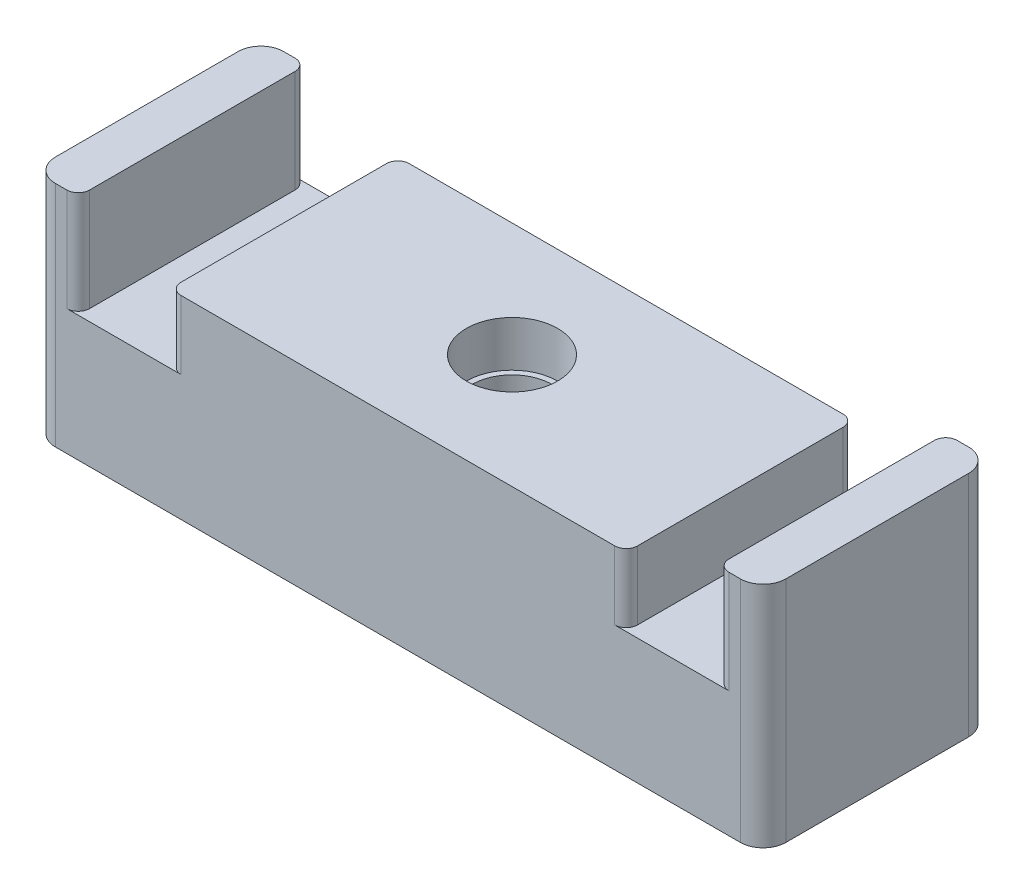
ISO-10303-21;
HEADER;
FILE_DESCRIPTION(('STEP AP214'),'2;1');
FILE_NAME('part.step','',(''),(''),'','','');
FILE_SCHEMA(('AUTOMOTIVE_DESIGN { 1 0 10303 214 1 1 1 1 }'));
ENDSEC;
DATA;
#1=APPLICATION_CONTEXT('core data for automotive mechanical design processes');
#2=APPLICATION_PROTOCOL_DEFINITION('international standard','automotive_design',2000,#1);
#3=PRODUCT_CONTEXT('',#1,'mechanical');
#4=PRODUCT('Part','Part','',(#3));
#5=PRODUCT_RELATED_PRODUCT_CATEGORY('part','',(#4));
#6=PRODUCT_DEFINITION_FORMATION('','',#4);
#7=PRODUCT_DEFINITION_CONTEXT('part definition',#1,'design');
#8=PRODUCT_DEFINITION('design','',#6,#7);
#9=PRODUCT_DEFINITION_SHAPE('','',#8);
#10=(LENGTH_UNIT() NAMED_UNIT(*) SI_UNIT(.MILLI.,.METRE.));
#11=(NAMED_UNIT(*) PLANE_ANGLE_UNIT() SI_UNIT($,.RADIAN.));
#12=(NAMED_UNIT(*) SI_UNIT($,.STERADIAN.) SOLID_ANGLE_UNIT());
#13=UNCERTAINTY_MEASURE_WITH_UNIT(LENGTH_MEASURE(1.E-05),#10,'distance_accuracy_value','');
#14=(GEOMETRIC_REPRESENTATION_CONTEXT(3) GLOBAL_UNCERTAINTY_ASSIGNED_CONTEXT((#13)) GLOBAL_UNIT_ASSIGNED_CONTEXT((#10,
#11,#12)) REPRESENTATION_CONTEXT('',''));
#15=CARTESIAN_POINT('',(0.,0.,0.));
#16=DIRECTION('',(0.,0.,1.));
#17=DIRECTION('',(1.,0.,0.));
#18=AXIS2_PLACEMENT_3D('',#15,#16,#17);
#19=CARTESIAN_POINT('',(0.,-7.5,5.));
#20=DIRECTION('',(0.,1.,0.));
#21=DIRECTION('',(0.,0.,1.));
#22=AXIS2_PLACEMENT_3D('',#19,#20,#21);
#23=CYLINDRICAL_SURFACE('',#22,1.75);
#24=CARTESIAN_POINT('',(0.,-7.5,5.));
#25=DIRECTION('',(0.,1.,0.));
#26=DIRECTION('',(0.,0.,1.));
#27=AXIS2_PLACEMENT_3D('',#24,#25,#26);
#28=CIRCLE('',#27,1.75);
#29=CARTESIAN_POINT('',(0.,-7.5,6.75));
#30=VERTEX_POINT('',#29);
#31=EDGE_CURVE('E275',#30,#30,#28,.T.);
#32=ORIENTED_EDGE('',*,*,#31,.F.);
#33=EDGE_LOOP('',(#32));
#34=FACE_BOUND('',#33,.T.);
#35=CARTESIAN_POINT('',(0.,-1.,5.));
#36=DIRECTION('',(0.,1.,0.));
#37=DIRECTION('',(0.,0.,1.));
#38=AXIS2_PLACEMENT_3D('',#35,#36,#37);
#39=CIRCLE('',#38,1.75);
#40=CARTESIAN_POINT('',(0.,-1.,6.75));
#41=VERTEX_POINT('',#40);
#42=EDGE_CURVE('E36',#41,#41,#39,.F.);
#43=ORIENTED_EDGE('',*,*,#42,.F.);
#44=EDGE_LOOP('',(#43));
#45=FACE_BOUND('',#44,.T.);
#46=ADVANCED_FACE('F32',(#34,#45),#23,.F.);
#47=CARTESIAN_POINT('',(10.,0.,10.));
#48=DIRECTION('',(-1.,0.,0.));
#49=DIRECTION('',(0.,-1.,0.));
#50=AXIS2_PLACEMENT_3D('',#47,#48,#49);
#51=PLANE('',#50);
#52=DIRECTION('',(0.,0.,-1.));
#53=VECTOR('',#52,1.);
#54=CARTESIAN_POINT('',(10.,0.999999999999997,0.));
#55=LINE('',#54,#53);
#56=CARTESIAN_POINT('',(10.,0.999999999999997,9.5));
#57=VERTEX_POINT('',#56);
#58=CARTESIAN_POINT('',(10.,0.999999999999997,0.500000000000001));
#59=VERTEX_POINT('',#58);
#60=EDGE_CURVE('E399',#57,#59,#55,.T.);
#61=ORIENTED_EDGE('',*,*,#60,.F.);
#62=DIRECTION('',(0.,1.,0.));
#63=VECTOR('',#62,1.);
#64=CARTESIAN_POINT('',(10.,0.,9.5));
#65=LINE('',#64,#63);
#66=CARTESIAN_POINT('',(10.,-2.,9.5));
#67=VERTEX_POINT('',#66);
#68=EDGE_CURVE('E230',#57,#67,#65,.F.);
#69=ORIENTED_EDGE('',*,*,#68,.T.);
#70=DIRECTION('',(0.,0.,-1.));
#71=VECTOR('',#70,1.);
#72=CARTESIAN_POINT('',(10.,-2.,10.));
#73=LINE('',#72,#71);
#74=CARTESIAN_POINT('',(10.,-2.,0.5));
#75=VERTEX_POINT('',#74);
#76=EDGE_CURVE('E295',#67,#75,#73,.T.);
#77=ORIENTED_EDGE('',*,*,#76,.T.);
#78=DIRECTION('',(0.,1.,0.));
#79=VECTOR('',#78,1.);
#80=CARTESIAN_POINT('',(10.,2.5,0.5));
#81=LINE('',#80,#79);
#82=EDGE_CURVE('E227',#75,#59,#81,.T.);
#83=ORIENTED_EDGE('',*,*,#82,.T.);
#84=EDGE_LOOP('',(#61,#69,#77,#83));
#85=FACE_BOUND('',#84,.T.);
#86=ADVANCED_FACE('F398',(#85),#51,.F.);
#87=CARTESIAN_POINT('',(-10.,0.,10.));
#88=DIRECTION('',(1.,0.,0.));
#89=DIRECTION('',(0.,1.,0.));
#90=AXIS2_PLACEMENT_3D('',#87,#88,#89);
#91=PLANE('',#90);
#92=DIRECTION('',(0.,0.,1.));
#93=VECTOR('',#92,1.);
#94=CARTESIAN_POINT('',(-10.,0.999999999999997,0.));
#95=LINE('',#94,#93);
#96=CARTESIAN_POINT('',(-10.,0.999999999999997,0.500000000000001));
#97=VERTEX_POINT('',#96);
#98=CARTESIAN_POINT('',(-10.,0.999999999999997,9.5));
#99=VERTEX_POINT('',#98);
#100=EDGE_CURVE('E193',#97,#99,#95,.T.);
#101=ORIENTED_EDGE('',*,*,#100,.F.);
#102=DIRECTION('',(0.,-1.,0.));
#103=VECTOR('',#102,1.);
#104=CARTESIAN_POINT('',(-10.,-2.,0.5));
#105=LINE('',#104,#103);
#106=CARTESIAN_POINT('',(-10.,-2.,0.5));
#107=VERTEX_POINT('',#106);
#108=EDGE_CURVE('E203',#97,#107,#105,.T.);
#109=ORIENTED_EDGE('',*,*,#108,.T.);
#110=DIRECTION('',(0.,0.,-1.));
#111=VECTOR('',#110,1.);
#112=CARTESIAN_POINT('',(-10.,-2.,10.));
#113=LINE('',#112,#111);
#114=CARTESIAN_POINT('',(-10.,-2.,9.5));
#115=VERTEX_POINT('',#114);
#116=EDGE_CURVE('E268',#115,#107,#113,.T.);
#117=ORIENTED_EDGE('',*,*,#116,.F.);
#118=DIRECTION('',(0.,-1.,0.));
#119=VECTOR('',#118,1.);
#120=CARTESIAN_POINT('',(-10.,0.,9.5));
#121=LINE('',#120,#119);
#122=EDGE_CURVE('E206',#115,#99,#121,.F.);
#123=ORIENTED_EDGE('',*,*,#122,.T.);
#124=EDGE_LOOP('',(#101,#109,#117,#123));
#125=FACE_BOUND('',#124,.T.);
#126=ADVANCED_FACE('F201',(#125),#91,.F.);
#127=CARTESIAN_POINT('',(10.,-2.,10.));
#128=DIRECTION('',(0.,0.,-1.));
#129=DIRECTION('',(-1.,0.,0.));
#130=AXIS2_PLACEMENT_3D('',#127,#128,#129);
#131=PLANE('',#130);
#132=DIRECTION('',(1.,0.,0.));
#133=VECTOR('',#132,1.);
#134=CARTESIAN_POINT('',(-10.,0.999999999999997,10.));
#135=LINE('',#134,#133);
#136=CARTESIAN_POINT('',(-9.5,0.999999999999997,10.));
#137=VERTEX_POINT('',#136);
#138=CARTESIAN_POINT('',(9.5,0.999999999999997,10.));
#139=VERTEX_POINT('',#138);
#140=EDGE_CURVE('E207',#137,#139,#135,.T.);
#141=ORIENTED_EDGE('',*,*,#140,.F.);
#142=DIRECTION('',(0.,-1.,0.));
#143=VECTOR('',#142,1.);
#144=CARTESIAN_POINT('',(-9.5,-2.00000000000002,10.));
#145=LINE('',#144,#143);
#146=CARTESIAN_POINT('',(-9.5,-2.,10.));
#147=VERTEX_POINT('',#146);
#148=EDGE_CURVE('E211',#137,#147,#145,.T.);
#149=ORIENTED_EDGE('',*,*,#148,.T.);
#150=DIRECTION('',(-1.,0.,0.));
#151=VECTOR('',#150,1.);
#152=CARTESIAN_POINT('',(-10.,-2.,10.));
#153=LINE('',#152,#151);
#154=CARTESIAN_POINT('',(-14.5,-2.00000000000001,10.));
#155=VERTEX_POINT('',#154);
#156=EDGE_CURVE('E294',#147,#155,#153,.T.);
#157=ORIENTED_EDGE('',*,*,#156,.T.);
#158=DIRECTION('',(0.,1.,0.));
#159=VECTOR('',#158,1.);
#160=CARTESIAN_POINT('',(-14.5,-2.00000000000002,10.));
#161=LINE('',#160,#159);
#162=CARTESIAN_POINT('',(-14.5,2.5,10.));
#163=VERTEX_POINT('',#162);
#164=EDGE_CURVE('E360',#155,#163,#161,.T.);
#165=ORIENTED_EDGE('',*,*,#164,.T.);
#166=DIRECTION('',(-1.,0.,0.));
#167=VECTOR('',#166,1.);
#168=CARTESIAN_POINT('',(-16.,2.5,10.));
#169=LINE('',#168,#167);
#170=CARTESIAN_POINT('',(-15.,2.5,10.));
#171=VERTEX_POINT('',#170);
#172=EDGE_CURVE('E415',#163,#171,#169,.T.);
#173=ORIENTED_EDGE('',*,*,#172,.T.);
#174=DIRECTION('',(0.,-1.,0.));
#175=VECTOR('',#174,1.);
#176=CARTESIAN_POINT('',(-15.,-2.,10.));
#177=LINE('',#176,#175);
#178=CARTESIAN_POINT('',(-15.,-7.5,10.));
#179=VERTEX_POINT('',#178);
#180=EDGE_CURVE('E348',#171,#179,#177,.T.);
#181=ORIENTED_EDGE('',*,*,#180,.T.);
#182=DIRECTION('',(1.,0.,0.));
#183=VECTOR('',#182,1.);
#184=CARTESIAN_POINT('',(-16.,-7.5,10.));
#185=LINE('',#184,#183);
#186=CARTESIAN_POINT('',(15.,-7.5,10.));
#187=VERTEX_POINT('',#186);
#188=EDGE_CURVE('E417',#179,#187,#185,.T.);
#189=ORIENTED_EDGE('',*,*,#188,.T.);
#190=DIRECTION('',(0.,1.,0.));
#191=VECTOR('',#190,1.);
#192=CARTESIAN_POINT('',(15.,-2.,10.));
#193=LINE('',#192,#191);
#194=CARTESIAN_POINT('',(15.,2.5,10.));
#195=VERTEX_POINT('',#194);
#196=EDGE_CURVE('E345',#187,#195,#193,.T.);
#197=ORIENTED_EDGE('',*,*,#196,.T.);
#198=DIRECTION('',(-1.,0.,0.));
#199=VECTOR('',#198,1.);
#200=CARTESIAN_POINT('',(14.,2.5,10.));
#201=LINE('',#200,#199);
#202=CARTESIAN_POINT('',(14.5,2.5,10.));
#203=VERTEX_POINT('',#202);
#204=EDGE_CURVE('E372',#195,#203,#201,.T.);
#205=ORIENTED_EDGE('',*,*,#204,.T.);
#206=DIRECTION('',(0.,-1.,0.));
#207=VECTOR('',#206,1.);
#208=CARTESIAN_POINT('',(14.5,-2.00000000000001,10.));
#209=LINE('',#208,#207);
#210=CARTESIAN_POINT('',(14.5,-2.00000000000001,10.));
#211=VERTEX_POINT('',#210);
#212=EDGE_CURVE('E215',#203,#211,#209,.T.);
#213=ORIENTED_EDGE('',*,*,#212,.T.);
#214=DIRECTION('',(-1.,0.,0.));
#215=VECTOR('',#214,1.);
#216=CARTESIAN_POINT('',(14.,-2.00000000000001,10.));
#217=LINE('',#216,#215);
#218=CARTESIAN_POINT('',(9.5,-2.,10.));
#219=VERTEX_POINT('',#218);
#220=EDGE_CURVE('E283',#211,#219,#217,.T.);
#221=ORIENTED_EDGE('',*,*,#220,.T.);
#222=DIRECTION('',(0.,1.,0.));
#223=VECTOR('',#222,1.);
#224=CARTESIAN_POINT('',(9.5,-2.,10.));
#225=LINE('',#224,#223);
#226=EDGE_CURVE('E363',#219,#139,#225,.T.);
#227=ORIENTED_EDGE('',*,*,#226,.T.);
#228=EDGE_LOOP('',(#141,#149,#157,#165,#173,#181,#189,#197,#205,#213,#221,#227));
#229=FACE_BOUND('',#228,.T.);
#230=ADVANCED_FACE('F370',(#229),#131,.F.);
#231=CARTESIAN_POINT('',(10.,-2.,0.));
#232=DIRECTION('',(0.,0.,-1.));
#233=DIRECTION('',(-1.,0.,0.));
#234=AXIS2_PLACEMENT_3D('',#231,#232,#233);
#235=PLANE('',#234);
#236=DIRECTION('',(0.,-1.,0.));
#237=VECTOR('',#236,1.);
#238=CARTESIAN_POINT('',(-9.5,2.5,0.));
#239=LINE('',#238,#237);
#240=CARTESIAN_POINT('',(-9.5,-2.,0.));
#241=VERTEX_POINT('',#240);
#242=CARTESIAN_POINT('',(-9.5,0.999999999999997,0.));
#243=VERTEX_POINT('',#242);
#244=EDGE_CURVE('E232',#241,#243,#239,.F.);
#245=ORIENTED_EDGE('',*,*,#244,.T.);
#246=DIRECTION('',(-1.,0.,0.));
#247=VECTOR('',#246,1.);
#248=CARTESIAN_POINT('',(-10.,0.999999999999997,0.));
#249=LINE('',#248,#247);
#250=CARTESIAN_POINT('',(9.5,0.999999999999997,0.));
#251=VERTEX_POINT('',#250);
#252=EDGE_CURVE('E48',#251,#243,#249,.T.);
#253=ORIENTED_EDGE('',*,*,#252,.F.);
#254=DIRECTION('',(0.,1.,0.));
#255=VECTOR('',#254,1.);
#256=CARTESIAN_POINT('',(9.5,-2.,0.));
#257=LINE('',#256,#255);
#258=CARTESIAN_POINT('',(9.5,-2.,0.));
#259=VERTEX_POINT('',#258);
#260=EDGE_CURVE('E237',#251,#259,#257,.F.);
#261=ORIENTED_EDGE('',*,*,#260,.T.);
#262=DIRECTION('',(-1.,0.,0.));
#263=VECTOR('',#262,1.);
#264=CARTESIAN_POINT('',(14.,-2.00000000000001,0.));
#265=LINE('',#264,#263);
#266=CARTESIAN_POINT('',(14.5,-2.00000000000001,0.));
#267=VERTEX_POINT('',#266);
#268=EDGE_CURVE('E291',#267,#259,#265,.T.);
#269=ORIENTED_EDGE('',*,*,#268,.F.);
#270=DIRECTION('',(0.,-1.,0.));
#271=VECTOR('',#270,1.);
#272=CARTESIAN_POINT('',(14.5,2.5,0.));
#273=LINE('',#272,#271);
#274=CARTESIAN_POINT('',(14.5,2.5,0.));
#275=VERTEX_POINT('',#274);
#276=EDGE_CURVE('E239',#267,#275,#273,.F.);
#277=ORIENTED_EDGE('',*,*,#276,.T.);
#278=DIRECTION('',(-1.,0.,0.));
#279=VECTOR('',#278,1.);
#280=CARTESIAN_POINT('',(14.,2.5,0.));
#281=LINE('',#280,#279);
#282=CARTESIAN_POINT('',(15.,2.5,0.));
#283=VERTEX_POINT('',#282);
#284=EDGE_CURVE('E288',#283,#275,#281,.T.);
#285=ORIENTED_EDGE('',*,*,#284,.F.);
#286=DIRECTION('',(0.,1.,0.));
#287=VECTOR('',#286,1.);
#288=CARTESIAN_POINT('',(15.,-7.5,0.));
#289=LINE('',#288,#287);
#290=CARTESIAN_POINT('',(15.,-7.5,0.));
#291=VERTEX_POINT('',#290);
#292=EDGE_CURVE('E335',#283,#291,#289,.F.);
#293=ORIENTED_EDGE('',*,*,#292,.T.);
#294=DIRECTION('',(1.,0.,0.));
#295=VECTOR('',#294,1.);
#296=CARTESIAN_POINT('',(-16.,-7.5,0.));
#297=LINE('',#296,#295);
#298=CARTESIAN_POINT('',(-15.,-7.5,0.));
#299=VERTEX_POINT('',#298);
#300=EDGE_CURVE('E277',#299,#291,#297,.T.);
#301=ORIENTED_EDGE('',*,*,#300,.F.);
#302=DIRECTION('',(0.,-1.,0.));
#303=VECTOR('',#302,1.);
#304=CARTESIAN_POINT('',(-15.,2.5,0.));
#305=LINE('',#304,#303);
#306=CARTESIAN_POINT('',(-15.,2.5,0.));
#307=VERTEX_POINT('',#306);
#308=EDGE_CURVE('E337',#299,#307,#305,.F.);
#309=ORIENTED_EDGE('',*,*,#308,.T.);
#310=DIRECTION('',(-1.,0.,0.));
#311=VECTOR('',#310,1.);
#312=CARTESIAN_POINT('',(-16.,2.5,0.));
#313=LINE('',#312,#311);
#314=CARTESIAN_POINT('',(-14.5,2.5,0.));
#315=VERTEX_POINT('',#314);
#316=EDGE_CURVE('E274',#315,#307,#313,.T.);
#317=ORIENTED_EDGE('',*,*,#316,.F.);
#318=DIRECTION('',(0.,1.,0.));
#319=VECTOR('',#318,1.);
#320=CARTESIAN_POINT('',(-14.5,-2.00000000000001,0.));
#321=LINE('',#320,#319);
#322=CARTESIAN_POINT('',(-14.5,-2.00000000000001,0.));
#323=VERTEX_POINT('',#322);
#324=EDGE_CURVE('E234',#315,#323,#321,.F.);
#325=ORIENTED_EDGE('',*,*,#324,.T.);
#326=DIRECTION('',(-1.,0.,0.));
#327=VECTOR('',#326,1.);
#328=CARTESIAN_POINT('',(-10.,-2.,0.));
#329=LINE('',#328,#327);
#330=EDGE_CURVE('E267',#241,#323,#329,.T.);
#331=ORIENTED_EDGE('',*,*,#330,.F.);
#332=EDGE_LOOP('',(#245,#253,#261,#269,#277,#285,#293,#301,#309,#317,#325,#331));
#333=FACE_BOUND('',#332,.T.);
#334=ADVANCED_FACE('F270',(#333),#235,.T.);
#335=CARTESIAN_POINT('',(-9.5,-2.00000000000002,9.5));
#336=DIRECTION('',(0.,-1.,0.));
#337=DIRECTION('',(1.,0.,0.));
#338=AXIS2_PLACEMENT_3D('',#335,#336,#337);
#339=CYLINDRICAL_SURFACE('',#338,0.5);
#340=ORIENTED_EDGE('',*,*,#148,.F.);
#341=CARTESIAN_POINT('',(-9.5,0.999999999999997,9.5));
#342=DIRECTION('',(0.,1.,0.));
#343=DIRECTION('',(0.,0.,1.));
#344=AXIS2_PLACEMENT_3D('',#341,#342,#343);
#345=CIRCLE('',#344,0.5);
#346=EDGE_CURVE('E280',#137,#99,#345,.F.);
#347=ORIENTED_EDGE('',*,*,#346,.T.);
#348=ORIENTED_EDGE('',*,*,#122,.F.);
#349=CARTESIAN_POINT('',(-9.5,-2.,9.5));
#350=DIRECTION('',(0.,-1.,0.));
#351=DIRECTION('',(1.,0.,0.));
#352=AXIS2_PLACEMENT_3D('',#349,#350,#351);
#353=CIRCLE('',#352,0.5);
#354=EDGE_CURVE('E250',#147,#115,#353,.T.);
#355=ORIENTED_EDGE('',*,*,#354,.F.);
#356=EDGE_LOOP('',(#340,#347,#348,#355));
#357=FACE_BOUND('',#356,.T.);
#358=ADVANCED_FACE('F412',(#357),#339,.T.);
#359=CARTESIAN_POINT('',(9.5,-2.,9.5));
#360=DIRECTION('',(0.,1.,0.));
#361=DIRECTION('',(-1.,0.,0.));
#362=AXIS2_PLACEMENT_3D('',#359,#360,#361);
#363=CYLINDRICAL_SURFACE('',#362,0.5);
#364=ORIENTED_EDGE('',*,*,#68,.F.);
#365=CARTESIAN_POINT('',(9.5,0.999999999999997,9.5));
#366=DIRECTION('',(0.,1.,0.));
#367=DIRECTION('',(0.,0.,1.));
#368=AXIS2_PLACEMENT_3D('',#365,#366,#367);
#369=CIRCLE('',#368,0.5);
#370=EDGE_CURVE('E406',#57,#139,#369,.F.);
#371=ORIENTED_EDGE('',*,*,#370,.T.);
#372=ORIENTED_EDGE('',*,*,#226,.F.);
#373=CARTESIAN_POINT('',(9.5,-2.,9.5));
#374=DIRECTION('',(0.,-1.,0.));
#375=DIRECTION('',(1.,0.,0.));
#376=AXIS2_PLACEMENT_3D('',#373,#374,#375);
#377=CIRCLE('',#376,0.5);
#378=EDGE_CURVE('E254',#67,#219,#377,.T.);
#379=ORIENTED_EDGE('',*,*,#378,.F.);
#380=EDGE_LOOP('',(#364,#371,#372,#379));
#381=FACE_BOUND('',#380,.T.);
#382=ADVANCED_FACE('F404',(#381),#363,.T.);
#383=CARTESIAN_POINT('',(9.5,0.,0.5));
#384=DIRECTION('',(0.,-1.,0.));
#385=DIRECTION('',(1.,0.,0.));
#386=AXIS2_PLACEMENT_3D('',#383,#384,#385);
#387=CYLINDRICAL_SURFACE('',#386,0.5);
#388=ORIENTED_EDGE('',*,*,#260,.F.);
#389=CARTESIAN_POINT('',(9.5,0.999999999999997,0.5));
#390=DIRECTION('',(0.,1.,0.));
#391=DIRECTION('',(0.,0.,1.));
#392=AXIS2_PLACEMENT_3D('',#389,#390,#391);
#393=CIRCLE('',#392,0.5);
#394=EDGE_CURVE('E395',#251,#59,#393,.F.);
#395=ORIENTED_EDGE('',*,*,#394,.T.);
#396=ORIENTED_EDGE('',*,*,#82,.F.);
#397=CARTESIAN_POINT('',(9.5,-2.,0.5));
#398=DIRECTION('',(0.,-1.,0.));
#399=DIRECTION('',(1.,0.,0.));
#400=AXIS2_PLACEMENT_3D('',#397,#398,#399);
#401=CIRCLE('',#400,0.5);
#402=EDGE_CURVE('E260',#259,#75,#401,.T.);
#403=ORIENTED_EDGE('',*,*,#402,.F.);
#404=EDGE_LOOP('',(#388,#395,#396,#403));
#405=FACE_BOUND('',#404,.T.);
#406=ADVANCED_FACE('F393',(#405),#387,.T.);
#407=CARTESIAN_POINT('',(-9.5,0.,0.5));
#408=DIRECTION('',(0.,1.,0.));
#409=DIRECTION('',(-1.,0.,0.));
#410=AXIS2_PLACEMENT_3D('',#407,#408,#409);
#411=CYLINDRICAL_SURFACE('',#410,0.5);
#412=ORIENTED_EDGE('',*,*,#108,.F.);
#413=CARTESIAN_POINT('',(-9.5,0.999999999999997,0.5));
#414=DIRECTION('',(0.,1.,0.));
#415=DIRECTION('',(0.,0.,1.));
#416=AXIS2_PLACEMENT_3D('',#413,#414,#415);
#417=CIRCLE('',#416,0.5);
#418=EDGE_CURVE('E11',#97,#243,#417,.F.);
#419=ORIENTED_EDGE('',*,*,#418,.T.);
#420=ORIENTED_EDGE('',*,*,#244,.F.);
#421=CARTESIAN_POINT('',(-9.5,-2.,0.5));
#422=DIRECTION('',(0.,-1.,0.));
#423=DIRECTION('',(1.,0.,0.));
#424=AXIS2_PLACEMENT_3D('',#421,#422,#423);
#425=CIRCLE('',#424,0.5);
#426=EDGE_CURVE('E41',#107,#241,#425,.T.);
#427=ORIENTED_EDGE('',*,*,#426,.F.);
#428=EDGE_LOOP('',(#412,#419,#420,#427));
#429=FACE_BOUND('',#428,.T.);
#430=ADVANCED_FACE('F34',(#429),#411,.T.);
#431=CARTESIAN_POINT('',(-10.,-2.,10.));
#432=DIRECTION('',(0.,-1.,0.));
#433=DIRECTION('',(1.,0.,0.));
#434=AXIS2_PLACEMENT_3D('',#431,#432,#433);
#435=PLANE('',#434);
#436=ORIENTED_EDGE('',*,*,#330,.T.);
#437=CARTESIAN_POINT('',(-14.5,-2.00000000000001,0.5));
#438=DIRECTION('',(0.,-1.,0.));
#439=DIRECTION('',(1.,0.,0.));
#440=AXIS2_PLACEMENT_3D('',#437,#438,#439);
#441=CIRCLE('',#440,0.5);
#442=CARTESIAN_POINT('',(-14.,-2.00000000000001,0.5));
#443=VERTEX_POINT('',#442);
#444=EDGE_CURVE('E55',#323,#443,#441,.T.);
#445=ORIENTED_EDGE('',*,*,#444,.T.);
#446=DIRECTION('',(0.,0.,-1.));
#447=VECTOR('',#446,1.);
#448=CARTESIAN_POINT('',(-14.,-2.00000000000001,10.));
#449=LINE('',#448,#447);
#450=CARTESIAN_POINT('',(-14.,-2.00000000000001,9.5));
#451=VERTEX_POINT('',#450);
#452=EDGE_CURVE('E319',#451,#443,#449,.T.);
#453=ORIENTED_EDGE('',*,*,#452,.F.);
#454=CARTESIAN_POINT('',(-14.5,-2.00000000000001,9.5));
#455=DIRECTION('',(0.,-1.,0.));
#456=DIRECTION('',(1.,0.,0.));
#457=AXIS2_PLACEMENT_3D('',#454,#455,#456);
#458=CIRCLE('',#457,0.5);
#459=EDGE_CURVE('E262',#451,#155,#458,.T.);
#460=ORIENTED_EDGE('',*,*,#459,.T.);
#461=ORIENTED_EDGE('',*,*,#156,.F.);
#462=ORIENTED_EDGE('',*,*,#354,.T.);
#463=ORIENTED_EDGE('',*,*,#116,.T.);
#464=ORIENTED_EDGE('',*,*,#426,.T.);
#465=EDGE_LOOP('',(#436,#445,#453,#460,#461,#462,#463,#464));
#466=FACE_BOUND('',#465,.T.);
#467=ADVANCED_FACE('F266',(#466),#435,.F.);
#468=CARTESIAN_POINT('',(-14.,2.5,10.));
#469=DIRECTION('',(-1.,0.,0.));
#470=DIRECTION('',(0.,-1.,0.));
#471=AXIS2_PLACEMENT_3D('',#468,#469,#470);
#472=PLANE('',#471);
#473=DIRECTION('',(0.,0.,-1.));
#474=VECTOR('',#473,1.);
#475=CARTESIAN_POINT('',(-14.,2.5,10.));
#476=LINE('',#475,#474);
#477=CARTESIAN_POINT('',(-14.,2.5,9.5));
#478=VERTEX_POINT('',#477);
#479=CARTESIAN_POINT('',(-14.,2.5,0.5));
#480=VERTEX_POINT('',#479);
#481=EDGE_CURVE('E316',#478,#480,#476,.T.);
#482=ORIENTED_EDGE('',*,*,#481,.F.);
#483=DIRECTION('',(0.,1.,0.));
#484=VECTOR('',#483,1.);
#485=CARTESIAN_POINT('',(-14.,2.5,9.5));
#486=LINE('',#485,#484);
#487=EDGE_CURVE('E248',#478,#451,#486,.F.);
#488=ORIENTED_EDGE('',*,*,#487,.T.);
#489=ORIENTED_EDGE('',*,*,#452,.T.);
#490=DIRECTION('',(0.,1.,0.));
#491=VECTOR('',#490,1.);
#492=CARTESIAN_POINT('',(-14.,2.5,0.5));
#493=LINE('',#492,#491);
#494=EDGE_CURVE('E245',#443,#480,#493,.T.);
#495=ORIENTED_EDGE('',*,*,#494,.T.);
#496=EDGE_LOOP('',(#482,#488,#489,#495));
#497=FACE_BOUND('',#496,.T.);
#498=ADVANCED_FACE('F499',(#497),#472,.F.);
#499=CARTESIAN_POINT('',(-16.,2.5,10.));
#500=DIRECTION('',(0.,-1.,0.));
#501=DIRECTION('',(1.,0.,0.));
#502=AXIS2_PLACEMENT_3D('',#499,#500,#501);
#503=PLANE('',#502);
#504=ORIENTED_EDGE('',*,*,#172,.F.);
#505=CARTESIAN_POINT('',(-14.5,2.5,9.5));
#506=DIRECTION('',(0.,-1.,0.));
#507=DIRECTION('',(1.,0.,0.));
#508=AXIS2_PLACEMENT_3D('',#505,#506,#507);
#509=CIRCLE('',#508,0.5);
#510=EDGE_CURVE('E243',#163,#478,#509,.F.);
#511=ORIENTED_EDGE('',*,*,#510,.T.);
#512=ORIENTED_EDGE('',*,*,#481,.T.);
#513=CARTESIAN_POINT('',(-14.5,2.5,0.5));
#514=DIRECTION('',(0.,-1.,0.));
#515=DIRECTION('',(1.,0.,0.));
#516=AXIS2_PLACEMENT_3D('',#513,#514,#515);
#517=CIRCLE('',#516,0.5);
#518=EDGE_CURVE('E241',#480,#315,#517,.F.);
#519=ORIENTED_EDGE('',*,*,#518,.T.);
#520=ORIENTED_EDGE('',*,*,#316,.T.);
#521=CARTESIAN_POINT('',(-15.,2.5,0.999999999999999));
#522=DIRECTION('',(0.,-1.,0.));
#523=DIRECTION('',(1.,0.,0.));
#524=AXIS2_PLACEMENT_3D('',#521,#522,#523);
#525=CIRCLE('',#524,1.);
#526=CARTESIAN_POINT('',(-16.,2.5,0.999999999999999));
#527=VERTEX_POINT('',#526);
#528=EDGE_CURVE('E343',#307,#527,#525,.F.);
#529=ORIENTED_EDGE('',*,*,#528,.T.);
#530=DIRECTION('',(0.,0.,-1.));
#531=VECTOR('',#530,1.);
#532=CARTESIAN_POINT('',(-16.,2.5,10.));
#533=LINE('',#532,#531);
#534=CARTESIAN_POINT('',(-16.,2.5,9.));
#535=VERTEX_POINT('',#534);
#536=EDGE_CURVE('E313',#535,#527,#533,.T.);
#537=ORIENTED_EDGE('',*,*,#536,.F.);
#538=CARTESIAN_POINT('',(-15.,2.5,9.));
#539=DIRECTION('',(0.,-1.,0.));
#540=DIRECTION('',(1.,0.,0.));
#541=AXIS2_PLACEMENT_3D('',#538,#539,#540);
#542=CIRCLE('',#541,1.);
#543=EDGE_CURVE('E340',#535,#171,#542,.F.);
#544=ORIENTED_EDGE('',*,*,#543,.T.);
#545=EDGE_LOOP('',(#504,#511,#512,#519,#520,#529,#537,#544));
#546=FACE_BOUND('',#545,.T.);
#547=ADVANCED_FACE('F457',(#546),#503,.F.);
#548=CARTESIAN_POINT('',(-16.,2.5,10.));
#549=DIRECTION('',(1.,0.,0.));
#550=DIRECTION('',(0.,0.,-1.));
#551=AXIS2_PLACEMENT_3D('',#548,#549,#550);
#552=PLANE('',#551);
#553=ORIENTED_EDGE('',*,*,#536,.T.);
#554=DIRECTION('',(0.,-1.,0.));
#555=VECTOR('',#554,1.);
#556=CARTESIAN_POINT('',(-16.,-7.5,0.999999999999999));
#557=LINE('',#556,#555);
#558=CARTESIAN_POINT('',(-16.,-7.5,0.999999999999999));
#559=VERTEX_POINT('',#558);
#560=EDGE_CURVE('E324',#527,#559,#557,.T.);
#561=ORIENTED_EDGE('',*,*,#560,.T.);
#562=DIRECTION('',(0.,0.,-1.));
#563=VECTOR('',#562,1.);
#564=CARTESIAN_POINT('',(-16.,-7.5,10.));
#565=LINE('',#564,#563);
#566=CARTESIAN_POINT('',(-16.,-7.5,9.));
#567=VERTEX_POINT('',#566);
#568=EDGE_CURVE('E310',#567,#559,#565,.T.);
#569=ORIENTED_EDGE('',*,*,#568,.F.);
#570=DIRECTION('',(0.,-1.,0.));
#571=VECTOR('',#570,1.);
#572=CARTESIAN_POINT('',(-16.,2.5,9.));
#573=LINE('',#572,#571);
#574=EDGE_CURVE('E322',#567,#535,#573,.F.);
#575=ORIENTED_EDGE('',*,*,#574,.T.);
#576=EDGE_LOOP('',(#553,#561,#569,#575));
#577=FACE_BOUND('',#576,.T.);
#578=ADVANCED_FACE('F451',(#577),#552,.F.);
#579=CARTESIAN_POINT('',(-16.,-7.5,10.));
#580=DIRECTION('',(0.,1.,0.));
#581=DIRECTION('',(0.,0.,1.));
#582=AXIS2_PLACEMENT_3D('',#579,#580,#581);
#583=PLANE('',#582);
#584=ORIENTED_EDGE('',*,*,#31,.T.);
#585=EDGE_LOOP('',(#584));
#586=FACE_BOUND('',#585,.T.);
#587=ORIENTED_EDGE('',*,*,#568,.T.);
#588=CARTESIAN_POINT('',(-15.,-7.5,0.999999999999999));
#589=DIRECTION('',(0.,1.,0.));
#590=DIRECTION('',(0.,0.,1.));
#591=AXIS2_PLACEMENT_3D('',#588,#589,#590);
#592=CIRCLE('',#591,1.);
#593=EDGE_CURVE('E333',#559,#299,#592,.F.);
#594=ORIENTED_EDGE('',*,*,#593,.T.);
#595=ORIENTED_EDGE('',*,*,#300,.T.);
#596=CARTESIAN_POINT('',(15.,-7.5,0.999999999999999));
#597=DIRECTION('',(0.,1.,0.));
#598=DIRECTION('',(0.,0.,1.));
#599=AXIS2_PLACEMENT_3D('',#596,#597,#598);
#600=CIRCLE('',#599,1.);
#601=CARTESIAN_POINT('',(16.,-7.5,0.999999999999999));
#602=VERTEX_POINT('',#601);
#603=EDGE_CURVE('E327',#291,#602,#600,.F.);
#604=ORIENTED_EDGE('',*,*,#603,.T.);
#605=DIRECTION('',(0.,0.,-1.));
#606=VECTOR('',#605,1.);
#607=CARTESIAN_POINT('',(16.,-7.5,10.));
#608=LINE('',#607,#606);
#609=CARTESIAN_POINT('',(16.,-7.5,9.));
#610=VERTEX_POINT('',#609);
#611=EDGE_CURVE('E307',#610,#602,#608,.T.);
#612=ORIENTED_EDGE('',*,*,#611,.F.);
#613=CARTESIAN_POINT('',(15.,-7.5,9.));
#614=DIRECTION('',(0.,1.,0.));
#615=DIRECTION('',(0.,0.,1.));
#616=AXIS2_PLACEMENT_3D('',#613,#614,#615);
#617=CIRCLE('',#616,1.);
#618=EDGE_CURVE('E329',#610,#187,#617,.F.);
#619=ORIENTED_EDGE('',*,*,#618,.T.);
#620=ORIENTED_EDGE('',*,*,#188,.F.);
#621=CARTESIAN_POINT('',(-15.,-7.5,9.));
#622=DIRECTION('',(0.,1.,0.));
#623=DIRECTION('',(0.,0.,1.));
#624=AXIS2_PLACEMENT_3D('',#621,#622,#623);
#625=CIRCLE('',#624,1.);
#626=EDGE_CURVE('E331',#179,#567,#625,.F.);
#627=ORIENTED_EDGE('',*,*,#626,.T.);
#628=EDGE_LOOP('',(#587,#594,#595,#604,#612,#619,#620,#627));
#629=FACE_BOUND('',#628,.T.);
#630=ADVANCED_FACE('F444',(#586,#629),#583,.F.);
#631=CARTESIAN_POINT('',(16.,2.5,10.));
#632=DIRECTION('',(-1.,0.,0.));
#633=DIRECTION('',(0.,0.,1.));
#634=AXIS2_PLACEMENT_3D('',#631,#632,#633);
#635=PLANE('',#634);
#636=DIRECTION('',(0.,0.,-1.));
#637=VECTOR('',#636,1.);
#638=CARTESIAN_POINT('',(16.,2.5,10.));
#639=LINE('',#638,#637);
#640=CARTESIAN_POINT('',(16.,2.5,9.));
#641=VERTEX_POINT('',#640);
#642=CARTESIAN_POINT('',(16.,2.5,0.999999999999999));
#643=VERTEX_POINT('',#642);
#644=EDGE_CURVE('E304',#641,#643,#639,.T.);
#645=ORIENTED_EDGE('',*,*,#644,.F.);
#646=DIRECTION('',(0.,1.,0.));
#647=VECTOR('',#646,1.);
#648=CARTESIAN_POINT('',(16.,2.5,9.));
#649=LINE('',#648,#647);
#650=EDGE_CURVE('E358',#641,#610,#649,.F.);
#651=ORIENTED_EDGE('',*,*,#650,.T.);
#652=ORIENTED_EDGE('',*,*,#611,.T.);
#653=DIRECTION('',(0.,1.,0.));
#654=VECTOR('',#653,1.);
#655=CARTESIAN_POINT('',(16.,2.5,0.999999999999999));
#656=LINE('',#655,#654);
#657=EDGE_CURVE('E355',#602,#643,#656,.T.);
#658=ORIENTED_EDGE('',*,*,#657,.T.);
#659=EDGE_LOOP('',(#645,#651,#652,#658));
#660=FACE_BOUND('',#659,.T.);
#661=ADVANCED_FACE('F434',(#660),#635,.F.);
#662=CARTESIAN_POINT('',(14.,2.5,10.));
#663=DIRECTION('',(0.,-1.,0.));
#664=DIRECTION('',(0.,0.,-1.));
#665=AXIS2_PLACEMENT_3D('',#662,#663,#664);
#666=PLANE('',#665);
#667=DIRECTION('',(0.,0.,-1.));
#668=VECTOR('',#667,1.);
#669=CARTESIAN_POINT('',(14.,2.5,10.));
#670=LINE('',#669,#668);
#671=CARTESIAN_POINT('',(14.,2.5,9.5));
#672=VERTEX_POINT('',#671);
#673=CARTESIAN_POINT('',(14.,2.5,0.5));
#674=VERTEX_POINT('',#673);
#675=EDGE_CURVE('E301',#672,#674,#670,.T.);
#676=ORIENTED_EDGE('',*,*,#675,.F.);
#677=CARTESIAN_POINT('',(14.5,2.5,9.5));
#678=DIRECTION('',(0.,-1.,0.));
#679=DIRECTION('',(0.,0.,-1.));
#680=AXIS2_PLACEMENT_3D('',#677,#678,#679);
#681=CIRCLE('',#680,0.5);
#682=EDGE_CURVE('E225',#672,#203,#681,.F.);
#683=ORIENTED_EDGE('',*,*,#682,.T.);
#684=ORIENTED_EDGE('',*,*,#204,.F.);
#685=CARTESIAN_POINT('',(15.,2.5,9.));
#686=DIRECTION('',(0.,-1.,0.));
#687=DIRECTION('',(0.,0.,-1.));
#688=AXIS2_PLACEMENT_3D('',#685,#686,#687);
#689=CIRCLE('',#688,1.);
#690=EDGE_CURVE('E353',#195,#641,#689,.F.);
#691=ORIENTED_EDGE('',*,*,#690,.T.);
#692=ORIENTED_EDGE('',*,*,#644,.T.);
#693=CARTESIAN_POINT('',(15.,2.5,0.999999999999999));
#694=DIRECTION('',(0.,-1.,0.));
#695=DIRECTION('',(0.,0.,-1.));
#696=AXIS2_PLACEMENT_3D('',#693,#694,#695);
#697=CIRCLE('',#696,1.);
#698=EDGE_CURVE('E351',#643,#283,#697,.F.);
#699=ORIENTED_EDGE('',*,*,#698,.T.);
#700=ORIENTED_EDGE('',*,*,#284,.T.);
#701=CARTESIAN_POINT('',(14.5,2.5,0.5));
#702=DIRECTION('',(0.,-1.,0.));
#703=DIRECTION('',(0.,0.,-1.));
#704=AXIS2_PLACEMENT_3D('',#701,#702,#703);
#705=CIRCLE('',#704,0.5);
#706=EDGE_CURVE('E223',#275,#674,#705,.F.);
#707=ORIENTED_EDGE('',*,*,#706,.T.);
#708=EDGE_LOOP('',(#676,#683,#684,#691,#692,#699,#700,#707));
#709=FACE_BOUND('',#708,.T.);
#710=ADVANCED_FACE('F432',(#709),#666,.F.);
#711=CARTESIAN_POINT('',(14.,0.,10.));
#712=DIRECTION('',(1.,0.,0.));
#713=DIRECTION('',(0.,1.,0.));
#714=AXIS2_PLACEMENT_3D('',#711,#712,#713);
#715=PLANE('',#714);
#716=DIRECTION('',(0.,0.,-1.));
#717=VECTOR('',#716,1.);
#718=CARTESIAN_POINT('',(14.,-2.00000000000001,10.));
#719=LINE('',#718,#717);
#720=CARTESIAN_POINT('',(14.,-2.00000000000001,9.5));
#721=VERTEX_POINT('',#720);
#722=CARTESIAN_POINT('',(14.,-2.00000000000001,0.5));
#723=VERTEX_POINT('',#722);
#724=EDGE_CURVE('E298',#721,#723,#719,.T.);
#725=ORIENTED_EDGE('',*,*,#724,.F.);
#726=DIRECTION('',(0.,-1.,0.));
#727=VECTOR('',#726,1.);
#728=CARTESIAN_POINT('',(14.,0.,9.5));
#729=LINE('',#728,#727);
#730=EDGE_CURVE('E221',#721,#672,#729,.F.);
#731=ORIENTED_EDGE('',*,*,#730,.T.);
#732=ORIENTED_EDGE('',*,*,#675,.T.);
#733=DIRECTION('',(0.,-1.,0.));
#734=VECTOR('',#733,1.);
#735=CARTESIAN_POINT('',(14.,-2.00000000000001,0.5));
#736=LINE('',#735,#734);
#737=EDGE_CURVE('E213',#674,#723,#736,.T.);
#738=ORIENTED_EDGE('',*,*,#737,.T.);
#739=EDGE_LOOP('',(#725,#731,#732,#738));
#740=FACE_BOUND('',#739,.T.);
#741=ADVANCED_FACE('F382',(#740),#715,.F.);
#742=CARTESIAN_POINT('',(14.,-2.00000000000001,10.));
#743=DIRECTION('',(0.,-1.,0.));
#744=DIRECTION('',(1.,0.,0.));
#745=AXIS2_PLACEMENT_3D('',#742,#743,#744);
#746=PLANE('',#745);
#747=ORIENTED_EDGE('',*,*,#268,.T.);
#748=ORIENTED_EDGE('',*,*,#402,.T.);
#749=ORIENTED_EDGE('',*,*,#76,.F.);
#750=ORIENTED_EDGE('',*,*,#378,.T.);
#751=ORIENTED_EDGE('',*,*,#220,.F.);
#752=CARTESIAN_POINT('',(14.5,-2.00000000000001,9.5));
#753=DIRECTION('',(0.,-1.,0.));
#754=DIRECTION('',(1.,0.,0.));
#755=AXIS2_PLACEMENT_3D('',#752,#753,#754);
#756=CIRCLE('',#755,0.5);
#757=EDGE_CURVE('E252',#211,#721,#756,.T.);
#758=ORIENTED_EDGE('',*,*,#757,.T.);
#759=ORIENTED_EDGE('',*,*,#724,.T.);
#760=CARTESIAN_POINT('',(14.5,-2.00000000000001,0.5));
#761=DIRECTION('',(0.,-1.,0.));
#762=DIRECTION('',(1.,0.,0.));
#763=AXIS2_PLACEMENT_3D('',#760,#761,#762);
#764=CIRCLE('',#763,0.5);
#765=EDGE_CURVE('E257',#723,#267,#764,.T.);
#766=ORIENTED_EDGE('',*,*,#765,.T.);
#767=EDGE_LOOP('',(#747,#748,#749,#750,#751,#758,#759,#766));
#768=FACE_BOUND('',#767,.T.);
#769=ADVANCED_FACE('F380',(#768),#746,.F.);
#770=CARTESIAN_POINT('',(-15.,2.5,0.999999999999999));
#771=DIRECTION('',(0.,1.,0.));
#772=DIRECTION('',(0.,0.,1.));
#773=AXIS2_PLACEMENT_3D('',#770,#771,#772);
#774=CYLINDRICAL_SURFACE('',#773,1.);
#775=ORIENTED_EDGE('',*,*,#528,.F.);
#776=ORIENTED_EDGE('',*,*,#308,.F.);
#777=ORIENTED_EDGE('',*,*,#593,.F.);
#778=ORIENTED_EDGE('',*,*,#560,.F.);
#779=EDGE_LOOP('',(#775,#776,#777,#778));
#780=FACE_BOUND('',#779,.T.);
#781=ADVANCED_FACE('F449',(#780),#774,.T.);
#782=CARTESIAN_POINT('',(-15.,-2.,9.));
#783=DIRECTION('',(0.,-1.,0.));
#784=DIRECTION('',(0.,0.,-1.));
#785=AXIS2_PLACEMENT_3D('',#782,#783,#784);
#786=CYLINDRICAL_SURFACE('',#785,1.);
#787=ORIENTED_EDGE('',*,*,#543,.F.);
#788=ORIENTED_EDGE('',*,*,#574,.F.);
#789=ORIENTED_EDGE('',*,*,#626,.F.);
#790=ORIENTED_EDGE('',*,*,#180,.F.);
#791=EDGE_LOOP('',(#787,#788,#789,#790));
#792=FACE_BOUND('',#791,.T.);
#793=ADVANCED_FACE('F459',(#792),#786,.T.);
#794=CARTESIAN_POINT('',(15.,-2.,9.));
#795=DIRECTION('',(0.,1.,0.));
#796=DIRECTION('',(0.,0.,1.));
#797=AXIS2_PLACEMENT_3D('',#794,#795,#796);
#798=CYLINDRICAL_SURFACE('',#797,1.);
#799=ORIENTED_EDGE('',*,*,#618,.F.);
#800=ORIENTED_EDGE('',*,*,#650,.F.);
#801=ORIENTED_EDGE('',*,*,#690,.F.);
#802=ORIENTED_EDGE('',*,*,#196,.F.);
#803=EDGE_LOOP('',(#799,#800,#801,#802));
#804=FACE_BOUND('',#803,.T.);
#805=ADVANCED_FACE('F428',(#804),#798,.T.);
#806=CARTESIAN_POINT('',(15.,2.5,0.999999999999999));
#807=DIRECTION('',(0.,-1.,0.));
#808=DIRECTION('',(0.,0.,-1.));
#809=AXIS2_PLACEMENT_3D('',#806,#807,#808);
#810=CYLINDRICAL_SURFACE('',#809,1.);
#811=ORIENTED_EDGE('',*,*,#603,.F.);
#812=ORIENTED_EDGE('',*,*,#292,.F.);
#813=ORIENTED_EDGE('',*,*,#698,.F.);
#814=ORIENTED_EDGE('',*,*,#657,.F.);
#815=EDGE_LOOP('',(#811,#812,#813,#814));
#816=FACE_BOUND('',#815,.T.);
#817=ADVANCED_FACE('F439',(#816),#810,.T.);
#818=CARTESIAN_POINT('',(14.5,-2.00000000000001,9.5));
#819=DIRECTION('',(0.,-1.,0.));
#820=DIRECTION('',(1.,0.,0.));
#821=AXIS2_PLACEMENT_3D('',#818,#819,#820);
#822=CYLINDRICAL_SURFACE('',#821,0.5);
#823=ORIENTED_EDGE('',*,*,#682,.F.);
#824=ORIENTED_EDGE('',*,*,#730,.F.);
#825=ORIENTED_EDGE('',*,*,#757,.F.);
#826=ORIENTED_EDGE('',*,*,#212,.F.);
#827=EDGE_LOOP('',(#823,#824,#825,#826));
#828=FACE_BOUND('',#827,.T.);
#829=ADVANCED_FACE('F376',(#828),#822,.T.);
#830=CARTESIAN_POINT('',(14.5,0.,0.5));
#831=DIRECTION('',(0.,1.,0.));
#832=DIRECTION('',(-1.,0.,0.));
#833=AXIS2_PLACEMENT_3D('',#830,#831,#832);
#834=CYLINDRICAL_SURFACE('',#833,0.5);
#835=ORIENTED_EDGE('',*,*,#706,.F.);
#836=ORIENTED_EDGE('',*,*,#276,.F.);
#837=ORIENTED_EDGE('',*,*,#765,.F.);
#838=ORIENTED_EDGE('',*,*,#737,.F.);
#839=EDGE_LOOP('',(#835,#836,#837,#838));
#840=FACE_BOUND('',#839,.T.);
#841=ADVANCED_FACE('F387',(#840),#834,.T.);
#842=CARTESIAN_POINT('',(-14.5,-2.00000000000002,9.5));
#843=DIRECTION('',(0.,1.,0.));
#844=DIRECTION('',(-1.,0.,0.));
#845=AXIS2_PLACEMENT_3D('',#842,#843,#844);
#846=CYLINDRICAL_SURFACE('',#845,0.5);
#847=ORIENTED_EDGE('',*,*,#459,.F.);
#848=ORIENTED_EDGE('',*,*,#487,.F.);
#849=ORIENTED_EDGE('',*,*,#510,.F.);
#850=ORIENTED_EDGE('',*,*,#164,.F.);
#851=EDGE_LOOP('',(#847,#848,#849,#850));
#852=FACE_BOUND('',#851,.T.);
#853=ADVANCED_FACE('F613',(#852),#846,.T.);
#854=CARTESIAN_POINT('',(-14.5,2.5,0.5));
#855=DIRECTION('',(0.,-1.,0.));
#856=DIRECTION('',(1.,0.,0.));
#857=AXIS2_PLACEMENT_3D('',#854,#855,#856);
#858=CYLINDRICAL_SURFACE('',#857,0.5);
#859=ORIENTED_EDGE('',*,*,#444,.F.);
#860=ORIENTED_EDGE('',*,*,#324,.F.);
#861=ORIENTED_EDGE('',*,*,#518,.F.);
#862=ORIENTED_EDGE('',*,*,#494,.F.);
#863=EDGE_LOOP('',(#859,#860,#861,#862));
#864=FACE_BOUND('',#863,.T.);
#865=ADVANCED_FACE('F620',(#864),#858,.T.);
#866=CARTESIAN_POINT('',(0.,0.999999999999997,0.));
#867=DIRECTION('',(0.,1.,0.));
#868=DIRECTION('',(0.,0.,1.));
#869=AXIS2_PLACEMENT_3D('',#866,#867,#868);
#870=PLANE('',#869);
#871=CARTESIAN_POINT('',(0.,0.999999999999997,5.));
#872=DIRECTION('',(0.,1.,0.));
#873=DIRECTION('',(0.,0.,1.));
#874=AXIS2_PLACEMENT_3D('',#871,#872,#873);
#875=CIRCLE('',#874,2.);
#876=CARTESIAN_POINT('',(0.,0.999999999999997,7.));
#877=VERTEX_POINT('',#876);
#878=EDGE_CURVE('E711',#877,#877,#875,.T.);
#879=ORIENTED_EDGE('',*,*,#878,.F.);
#880=EDGE_LOOP('',(#879));
#881=FACE_BOUND('',#880,.T.);
#882=ORIENTED_EDGE('',*,*,#140,.T.);
#883=ORIENTED_EDGE('',*,*,#370,.F.);
#884=ORIENTED_EDGE('',*,*,#60,.T.);
#885=ORIENTED_EDGE('',*,*,#394,.F.);
#886=ORIENTED_EDGE('',*,*,#252,.T.);
#887=ORIENTED_EDGE('',*,*,#418,.F.);
#888=ORIENTED_EDGE('',*,*,#100,.T.);
#889=ORIENTED_EDGE('',*,*,#346,.F.);
#890=EDGE_LOOP('',(#882,#883,#884,#885,#886,#887,#888,#889));
#891=FACE_BOUND('',#890,.T.);
#892=ADVANCED_FACE('F192',(#881,#891),#870,.T.);
#893=CARTESIAN_POINT('',(0.,-1.,5.));
#894=DIRECTION('',(0.,1.,0.));
#895=DIRECTION('',(0.,0.,1.));
#896=AXIS2_PLACEMENT_3D('',#893,#894,#895);
#897=PLANE('',#896);
#898=CARTESIAN_POINT('',(0.,-1.,5.));
#899=DIRECTION('',(0.,1.,0.));
#900=DIRECTION('',(0.,0.,1.));
#901=AXIS2_PLACEMENT_3D('',#898,#899,#900);
#902=CIRCLE('',#901,2.);
#903=CARTESIAN_POINT('',(0.,-1.,7.));
#904=VERTEX_POINT('',#903);
#905=EDGE_CURVE('E708',#904,#904,#902,.T.);
#906=ORIENTED_EDGE('',*,*,#905,.T.);
#907=EDGE_LOOP('',(#906));
#908=FACE_BOUND('',#907,.T.);
#909=ORIENTED_EDGE('',*,*,#42,.T.);
#910=EDGE_LOOP('',(#909));
#911=FACE_BOUND('',#910,.T.);
#912=ADVANCED_FACE('F634',(#908,#911),#897,.T.);
#913=CARTESIAN_POINT('',(0.,-1.,5.));
#914=DIRECTION('',(0.,1.,0.));
#915=DIRECTION('',(0.,0.,1.));
#916=AXIS2_PLACEMENT_3D('',#913,#914,#915);
#917=CYLINDRICAL_SURFACE('',#916,2.);
#918=ORIENTED_EDGE('',*,*,#905,.F.);
#919=EDGE_LOOP('',(#918));
#920=FACE_BOUND('',#919,.T.);
#921=ORIENTED_EDGE('',*,*,#878,.T.);
#922=EDGE_LOOP('',(#921));
#923=FACE_BOUND('',#922,.T.);
#924=ADVANCED_FACE('F641',(#920,#923),#917,.F.);
#925=CLOSED_SHELL('',(#46,#86,#126,#230,#334,#358,#382,#406,#430,#467,#498,#547,#578,#630,#661,
#710,#741,#769,#781,#793,#805,#817,#829,#841,#853,#865,#892,#912,#924));
#926=MANIFOLD_SOLID_BREP('B2',#925);
#927=ADVANCED_BREP_SHAPE_REPRESENTATION('',(#18,#926),#14);
#928=SHAPE_DEFINITION_REPRESENTATION(#9,#927);
ENDSEC;
END-ISO-10303-21;
